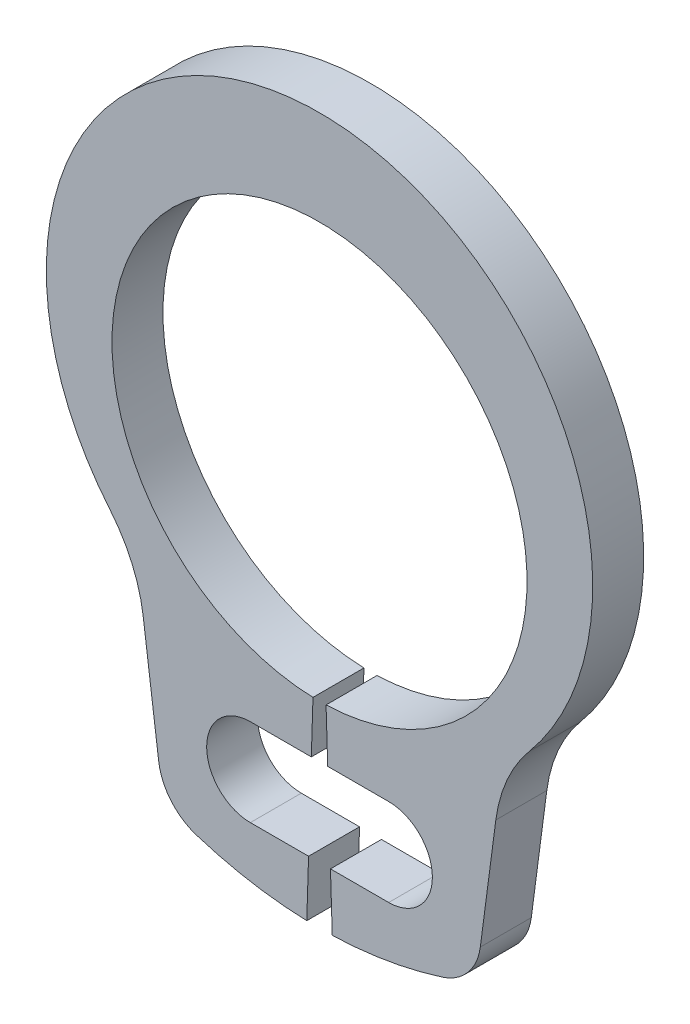
ISO-10303-21;
HEADER;
FILE_DESCRIPTION(('STEP AP214'),'2;1');
FILE_NAME('part.step','',(''),(''),'','','');
FILE_SCHEMA(('AUTOMOTIVE_DESIGN { 1 0 10303 214 1 1 1 1 }'));
ENDSEC;
DATA;
#1=APPLICATION_CONTEXT('core data for automotive mechanical design processes');
#2=APPLICATION_PROTOCOL_DEFINITION('international standard','automotive_design',2000,#1);
#3=PRODUCT_CONTEXT('',#1,'mechanical');
#4=PRODUCT('Part','Part','',(#3));
#5=PRODUCT_RELATED_PRODUCT_CATEGORY('part','',(#4));
#6=PRODUCT_DEFINITION_FORMATION('','',#4);
#7=PRODUCT_DEFINITION_CONTEXT('part definition',#1,'design');
#8=PRODUCT_DEFINITION('design','',#6,#7);
#9=PRODUCT_DEFINITION_SHAPE('','',#8);
#10=(LENGTH_UNIT() NAMED_UNIT(*) SI_UNIT(.MILLI.,.METRE.));
#11=(NAMED_UNIT(*) PLANE_ANGLE_UNIT() SI_UNIT($,.RADIAN.));
#12=(NAMED_UNIT(*) SI_UNIT($,.STERADIAN.) SOLID_ANGLE_UNIT());
#13=UNCERTAINTY_MEASURE_WITH_UNIT(LENGTH_MEASURE(1.E-05),#10,'distance_accuracy_value','');
#14=(GEOMETRIC_REPRESENTATION_CONTEXT(3) GLOBAL_UNCERTAINTY_ASSIGNED_CONTEXT((#13)) GLOBAL_UNIT_ASSIGNED_CONTEXT((#10,
#11,#12)) REPRESENTATION_CONTEXT('',''));
#15=CARTESIAN_POINT('',(0.,0.,0.));
#16=DIRECTION('',(0.,0.,1.));
#17=DIRECTION('',(1.,0.,0.));
#18=AXIS2_PLACEMENT_3D('',#15,#16,#17);
#19=CARTESIAN_POINT('',(-0.0898648648648649,-2.84858285925876,-0.7));
#20=DIRECTION('',(0.999502757634653,-0.0315315315315315,0.));
#21=DIRECTION('',(0.0315315315315315,0.999502757634653,0.));
#22=AXIS2_PLACEMENT_3D('',#19,#20,#21);
#23=PLANE('',#22);
#24=DIRECTION('',(0.,0.,1.));
#25=VECTOR('',#24,1.);
#26=CARTESIAN_POINT('',(-0.112563884090892,-3.56810808401126,-0.7));
#27=LINE('',#26,#25);
#28=CARTESIAN_POINT('',(-0.112563884090892,-3.56810808401126,-0.7));
#29=VERTEX_POINT('',#28);
#30=CARTESIAN_POINT('',(-0.112563884090892,-3.56810808401126,0.));
#31=VERTEX_POINT('',#30);
#32=EDGE_CURVE('E208',#29,#31,#27,.T.);
#33=ORIENTED_EDGE('',*,*,#32,.F.);
#34=DIRECTION('',(0.0315315315315315,0.999502757634653,0.));
#35=VECTOR('',#34,1.);
#36=CARTESIAN_POINT('',(-0.0898648648648649,-2.84858285925876,-0.7));
#37=LINE('',#36,#35);
#38=CARTESIAN_POINT('',(-0.0898648648648649,-2.84858285925876,-0.7));
#39=VERTEX_POINT('',#38);
#40=EDGE_CURVE('E198',#29,#39,#37,.T.);
#41=ORIENTED_EDGE('',*,*,#40,.T.);
#42=DIRECTION('',(0.,0.,1.));
#43=VECTOR('',#42,1.);
#44=CARTESIAN_POINT('',(-0.0898648648648649,-2.84858285925876,-0.7));
#45=LINE('',#44,#43);
#46=CARTESIAN_POINT('',(-0.0898648648648649,-2.84858285925876,0.));
#47=VERTEX_POINT('',#46);
#48=EDGE_CURVE('E11',#39,#47,#45,.T.);
#49=ORIENTED_EDGE('',*,*,#48,.T.);
#50=DIRECTION('',(0.0315315315315315,0.999502757634653,0.));
#51=VECTOR('',#50,1.);
#52=CARTESIAN_POINT('',(-0.0898648648648649,-2.84858285925876,0.));
#53=LINE('',#52,#51);
#54=EDGE_CURVE('E288',#31,#47,#53,.T.);
#55=ORIENTED_EDGE('',*,*,#54,.F.);
#56=EDGE_LOOP('',(#33,#41,#49,#55));
#57=FACE_BOUND('',#56,.T.);
#58=ADVANCED_FACE('F39',(#57),#23,.T.);
#59=CARTESIAN_POINT('',(0.0898648648648649,-2.84858285925876,-0.7));
#60=DIRECTION('',(-0.999502757634653,-0.0315315315315315,0.));
#61=DIRECTION('',(0.0315315315315315,-0.999502757634653,0.));
#62=AXIS2_PLACEMENT_3D('',#59,#60,#61);
#63=PLANE('',#62);
#64=DIRECTION('',(0.,0.,-1.));
#65=VECTOR('',#64,1.);
#66=CARTESIAN_POINT('',(0.112563884090892,-3.56810808401126,-0.7));
#67=LINE('',#66,#65);
#68=CARTESIAN_POINT('',(0.112563884090892,-3.56810808401126,0.));
#69=VERTEX_POINT('',#68);
#70=CARTESIAN_POINT('',(0.112563884090892,-3.56810808401126,-0.7));
#71=VERTEX_POINT('',#70);
#72=EDGE_CURVE('E322',#69,#71,#67,.T.);
#73=ORIENTED_EDGE('',*,*,#72,.F.);
#74=DIRECTION('',(0.0315315315315315,-0.999502757634653,0.));
#75=VECTOR('',#74,1.);
#76=CARTESIAN_POINT('',(0.0898648648648649,-2.84858285925876,0.));
#77=LINE('',#76,#75);
#78=CARTESIAN_POINT('',(0.0898648648648649,-2.84858285925876,0.));
#79=VERTEX_POINT('',#78);
#80=EDGE_CURVE('E259',#79,#69,#77,.T.);
#81=ORIENTED_EDGE('',*,*,#80,.F.);
#82=DIRECTION('',(0.,0.,1.));
#83=VECTOR('',#82,1.);
#84=CARTESIAN_POINT('',(0.0898648648648649,-2.84858285925876,-0.7));
#85=LINE('',#84,#83);
#86=CARTESIAN_POINT('',(0.0898648648648649,-2.84858285925876,-0.7));
#87=VERTEX_POINT('',#86);
#88=EDGE_CURVE('E43',#87,#79,#85,.T.);
#89=ORIENTED_EDGE('',*,*,#88,.F.);
#90=DIRECTION('',(0.0315315315315315,-0.999502757634653,0.));
#91=VECTOR('',#90,1.);
#92=CARTESIAN_POINT('',(0.0898648648648649,-2.84858285925876,-0.7));
#93=LINE('',#92,#91);
#94=EDGE_CURVE('E225',#87,#71,#93,.T.);
#95=ORIENTED_EDGE('',*,*,#94,.T.);
#96=EDGE_LOOP('',(#73,#81,#89,#95));
#97=FACE_BOUND('',#96,.T.);
#98=ADVANCED_FACE('F318',(#97),#63,.T.);
#99=CARTESIAN_POINT('',(0.,0.,-0.7));
#100=DIRECTION('',(0.,0.,1.));
#101=DIRECTION('',(1.,0.,0.));
#102=AXIS2_PLACEMENT_3D('',#99,#100,#101);
#103=CYLINDRICAL_SURFACE('',#102,2.85);
#104=CARTESIAN_POINT('',(0.,0.,0.));
#105=DIRECTION('',(0.,0.,-1.));
#106=DIRECTION('',(1.,0.,0.));
#107=AXIS2_PLACEMENT_3D('',#104,#105,#106);
#108=CIRCLE('',#107,2.85);
#109=EDGE_CURVE('E213',#47,#79,#108,.T.);
#110=ORIENTED_EDGE('',*,*,#109,.F.);
#111=ORIENTED_EDGE('',*,*,#48,.F.);
#112=CARTESIAN_POINT('',(0.,0.,-0.7));
#113=DIRECTION('',(0.,0.,-1.));
#114=DIRECTION('',(1.,0.,0.));
#115=AXIS2_PLACEMENT_3D('',#112,#113,#114);
#116=CIRCLE('',#115,2.85);
#117=EDGE_CURVE('E217',#39,#87,#116,.T.);
#118=ORIENTED_EDGE('',*,*,#117,.T.);
#119=ORIENTED_EDGE('',*,*,#88,.T.);
#120=EDGE_LOOP('',(#110,#111,#118,#119));
#121=FACE_BOUND('',#120,.T.);
#122=ADVANCED_FACE('F41',(#121),#103,.F.);
#123=DIRECTION('',(0.,0.,-1.));
#124=VECTOR('',#123,1.);
#125=CARTESIAN_POINT('',(-0.150420545864774,-4.76810808401126,-0.7));
#126=LINE('',#125,#124);
#127=CARTESIAN_POINT('',(-0.150420545864773,-4.76810808401126,0.));
#128=VERTEX_POINT('',#127);
#129=CARTESIAN_POINT('',(-0.150420545864773,-4.76810808401126,-0.7));
#130=VERTEX_POINT('',#129);
#131=EDGE_CURVE('E345',#128,#130,#126,.T.);
#132=ORIENTED_EDGE('',*,*,#131,.F.);
#133=CARTESIAN_POINT('',(-0.175,-5.54724030487233,0.));
#134=VERTEX_POINT('',#133);
#135=EDGE_CURVE('E221',#134,#128,#53,.T.);
#136=ORIENTED_EDGE('',*,*,#135,.F.);
#137=DIRECTION('',(0.,0.,1.));
#138=VECTOR('',#137,1.);
#139=CARTESIAN_POINT('',(-0.175,-5.54724030487233,-0.7));
#140=LINE('',#139,#138);
#141=CARTESIAN_POINT('',(-0.175,-5.54724030487233,-0.7));
#142=VERTEX_POINT('',#141);
#143=EDGE_CURVE('E48',#142,#134,#140,.T.);
#144=ORIENTED_EDGE('',*,*,#143,.F.);
#145=EDGE_CURVE('E255',#142,#130,#37,.T.);
#146=ORIENTED_EDGE('',*,*,#145,.T.);
#147=EDGE_LOOP('',(#132,#136,#144,#146));
#148=FACE_BOUND('',#147,.T.);
#149=ADVANCED_FACE('F388',(#148),#23,.T.);
#150=CARTESIAN_POINT('',(0.,0.,-0.7));
#151=DIRECTION('',(0.,0.,1.));
#152=DIRECTION('',(1.,0.,0.));
#153=AXIS2_PLACEMENT_3D('',#150,#151,#152);
#154=CYLINDRICAL_SURFACE('',#153,5.55);
#155=CARTESIAN_POINT('',(0.,0.,0.));
#156=DIRECTION('',(0.,0.,1.));
#157=DIRECTION('',(1.,0.,0.));
#158=AXIS2_PLACEMENT_3D('',#155,#156,#157);
#159=CIRCLE('',#158,5.55);
#160=CARTESIAN_POINT('',(-1.69352555944154,-5.28530710361453,0.));
#161=VERTEX_POINT('',#160);
#162=EDGE_CURVE('E285',#161,#134,#159,.T.);
#163=ORIENTED_EDGE('',*,*,#162,.F.);
#164=DIRECTION('',(0.,0.,1.));
#165=VECTOR('',#164,1.);
#166=CARTESIAN_POINT('',(-1.69352555944154,-5.28530710361453,-0.7));
#167=LINE('',#166,#165);
#168=CARTESIAN_POINT('',(-1.69352555944154,-5.28530710361453,-0.7));
#169=VERTEX_POINT('',#168);
#170=EDGE_CURVE('E292',#169,#161,#167,.T.);
#171=ORIENTED_EDGE('',*,*,#170,.F.);
#172=CARTESIAN_POINT('',(0.,0.,-0.7));
#173=DIRECTION('',(0.,0.,1.));
#174=DIRECTION('',(1.,0.,0.));
#175=AXIS2_PLACEMENT_3D('',#172,#173,#174);
#176=CIRCLE('',#175,5.55);
#177=EDGE_CURVE('E248',#169,#142,#176,.T.);
#178=ORIENTED_EDGE('',*,*,#177,.T.);
#179=ORIENTED_EDGE('',*,*,#143,.T.);
#180=EDGE_LOOP('',(#163,#171,#178,#179));
#181=FACE_BOUND('',#180,.T.);
#182=ADVANCED_FACE('F387',(#181),#154,.T.);
#183=CARTESIAN_POINT('',(-1.4646707541116,-4.5710764139369,-0.7));
#184=DIRECTION('',(0.,0.,1.));
#185=DIRECTION('',(1.,0.,0.));
#186=AXIS2_PLACEMENT_3D('',#183,#184,#185);
#187=CYLINDRICAL_SURFACE('',#186,0.750000000000001);
#188=CARTESIAN_POINT('',(-1.4646707541116,-4.5710764139369,0.));
#189=DIRECTION('',(0.,0.,1.));
#190=DIRECTION('',(1.,0.,0.));
#191=AXIS2_PLACEMENT_3D('',#188,#189,#190);
#192=CIRCLE('',#191,0.750000000000001);
#193=CARTESIAN_POINT('',(-2.20825440014195,-4.66897105810193,0.));
#194=VERTEX_POINT('',#193);
#195=EDGE_CURVE('E282',#194,#161,#192,.T.);
#196=ORIENTED_EDGE('',*,*,#195,.F.);
#197=DIRECTION('',(0.,0.,1.));
#198=VECTOR('',#197,1.);
#199=CARTESIAN_POINT('',(-2.20825440014195,-4.66897105810193,-0.7));
#200=LINE('',#199,#198);
#201=CARTESIAN_POINT('',(-2.20825440014195,-4.66897105810193,-0.7));
#202=VERTEX_POINT('',#201);
#203=EDGE_CURVE('E295',#202,#194,#200,.T.);
#204=ORIENTED_EDGE('',*,*,#203,.F.);
#205=CARTESIAN_POINT('',(-1.4646707541116,-4.5710764139369,-0.7));
#206=DIRECTION('',(0.,0.,1.));
#207=DIRECTION('',(1.,0.,0.));
#208=AXIS2_PLACEMENT_3D('',#205,#206,#207);
#209=CIRCLE('',#208,0.750000000000001);
#210=EDGE_CURVE('E246',#202,#169,#209,.T.);
#211=ORIENTED_EDGE('',*,*,#210,.T.);
#212=ORIENTED_EDGE('',*,*,#170,.T.);
#213=EDGE_LOOP('',(#196,#204,#211,#212));
#214=FACE_BOUND('',#213,.T.);
#215=ADVANCED_FACE('F385',(#214),#187,.T.);
#216=CARTESIAN_POINT('',(-2.42125260136697,-3.05108909514396,-0.7));
#217=DIRECTION('',(-0.99144486137381,-0.130526192220052,0.));
#218=DIRECTION('',(0.130526192220052,-0.99144486137381,0.));
#219=AXIS2_PLACEMENT_3D('',#216,#217,#218);
#220=PLANE('',#219);
#221=DIRECTION('',(0.130526192220052,-0.99144486137381,0.));
#222=VECTOR('',#221,1.);
#223=CARTESIAN_POINT('',(-2.42125260136697,-3.05108909514396,0.));
#224=LINE('',#223,#222);
#225=CARTESIAN_POINT('',(-2.42125260136697,-3.05108909514396,0.));
#226=VERTEX_POINT('',#225);
#227=EDGE_CURVE('E276',#226,#194,#224,.T.);
#228=ORIENTED_EDGE('',*,*,#227,.F.);
#229=DIRECTION('',(0.,0.,1.));
#230=VECTOR('',#229,1.);
#231=CARTESIAN_POINT('',(-2.42125260136697,-3.05108909514396,-0.7));
#232=LINE('',#231,#230);
#233=CARTESIAN_POINT('',(-2.42125260136697,-3.05108909514396,-0.7));
#234=VERTEX_POINT('',#233);
#235=EDGE_CURVE('E298',#234,#226,#232,.T.);
#236=ORIENTED_EDGE('',*,*,#235,.F.);
#237=DIRECTION('',(0.130526192220052,-0.99144486137381,0.));
#238=VECTOR('',#237,1.);
#239=CARTESIAN_POINT('',(-2.42125260136697,-3.05108909514396,-0.7));
#240=LINE('',#239,#238);
#241=EDGE_CURVE('E243',#234,#202,#240,.T.);
#242=ORIENTED_EDGE('',*,*,#241,.T.);
#243=ORIENTED_EDGE('',*,*,#203,.T.);
#244=EDGE_LOOP('',(#228,#236,#242,#243));
#245=FACE_BOUND('',#244,.T.);
#246=ADVANCED_FACE('F380',(#245),#220,.T.);
#247=CARTESIAN_POINT('',(-4.44894498459351,-3.31803986173468,-0.7));
#248=DIRECTION('',(0.,0.,1.));
#249=DIRECTION('',(1.,0.,0.));
#250=AXIS2_PLACEMENT_3D('',#247,#248,#249);
#251=CYLINDRICAL_SURFACE('',#250,2.04518926087008);
#252=CARTESIAN_POINT('',(-4.44894498459351,-3.31803986173468,0.));
#253=DIRECTION('',(0.,0.,-1.));
#254=DIRECTION('',(1.,0.,0.));
#255=AXIS2_PLACEMENT_3D('',#252,#253,#254);
#256=CIRCLE('',#255,2.04518926087008);
#257=CARTESIAN_POINT('',(-2.87932657231504,-2.00689640939443,0.));
#258=VERTEX_POINT('',#257);
#259=EDGE_CURVE('E277',#258,#226,#256,.T.);
#260=ORIENTED_EDGE('',*,*,#259,.F.);
#261=DIRECTION('',(0.,0.,1.));
#262=VECTOR('',#261,1.);
#263=CARTESIAN_POINT('',(-2.87932657231504,-2.00689640939443,-0.7));
#264=LINE('',#263,#262);
#265=CARTESIAN_POINT('',(-2.87932657231504,-2.00689640939443,-0.7));
#266=VERTEX_POINT('',#265);
#267=EDGE_CURVE('E296',#266,#258,#264,.T.);
#268=ORIENTED_EDGE('',*,*,#267,.F.);
#269=CARTESIAN_POINT('',(-4.44894498459351,-3.31803986173468,-0.7));
#270=DIRECTION('',(0.,0.,-1.));
#271=DIRECTION('',(1.,0.,0.));
#272=AXIS2_PLACEMENT_3D('',#269,#270,#271);
#273=CIRCLE('',#272,2.04518926087008);
#274=EDGE_CURVE('E239',#266,#234,#273,.T.);
#275=ORIENTED_EDGE('',*,*,#274,.T.);
#276=ORIENTED_EDGE('',*,*,#235,.T.);
#277=EDGE_LOOP('',(#260,#268,#275,#276));
#278=FACE_BOUND('',#277,.T.);
#279=ADVANCED_FACE('F373',(#278),#251,.F.);
#280=CARTESIAN_POINT('',(0.,0.398280640586792,-0.7));
#281=DIRECTION('',(0.,0.,1.));
#282=DIRECTION('',(1.,0.,0.));
#283=AXIS2_PLACEMENT_3D('',#280,#281,#282);
#284=CYLINDRICAL_SURFACE('',#283,3.75171935941321);
#285=CARTESIAN_POINT('',(0.,0.398280640586792,0.));
#286=DIRECTION('',(0.,0.,1.));
#287=DIRECTION('',(1.,0.,0.));
#288=AXIS2_PLACEMENT_3D('',#285,#286,#287);
#289=CIRCLE('',#288,3.75171935941321);
#290=CARTESIAN_POINT('',(2.87932657231504,-2.00689640939443,0.));
#291=VERTEX_POINT('',#290);
#292=EDGE_CURVE('E271',#291,#258,#289,.T.);
#293=ORIENTED_EDGE('',*,*,#292,.F.);
#294=DIRECTION('',(0.,0.,1.));
#295=VECTOR('',#294,1.);
#296=CARTESIAN_POINT('',(2.87932657231504,-2.00689640939443,-0.7));
#297=LINE('',#296,#295);
#298=CARTESIAN_POINT('',(2.87932657231504,-2.00689640939443,-0.7));
#299=VERTEX_POINT('',#298);
#300=EDGE_CURVE('E297',#299,#291,#297,.T.);
#301=ORIENTED_EDGE('',*,*,#300,.F.);
#302=CARTESIAN_POINT('',(0.,0.398280640586792,-0.7));
#303=DIRECTION('',(0.,0.,1.));
#304=DIRECTION('',(1.,0.,0.));
#305=AXIS2_PLACEMENT_3D('',#302,#303,#304);
#306=CIRCLE('',#305,3.75171935941321);
#307=EDGE_CURVE('E240',#299,#266,#306,.T.);
#308=ORIENTED_EDGE('',*,*,#307,.T.);
#309=ORIENTED_EDGE('',*,*,#267,.T.);
#310=EDGE_LOOP('',(#293,#301,#308,#309));
#311=FACE_BOUND('',#310,.T.);
#312=ADVANCED_FACE('F367',(#311),#284,.T.);
#313=CARTESIAN_POINT('',(4.44894498459351,-3.31803986173468,-0.7));
#314=DIRECTION('',(0.,0.,1.));
#315=DIRECTION('',(1.,0.,0.));
#316=AXIS2_PLACEMENT_3D('',#313,#314,#315);
#317=CYLINDRICAL_SURFACE('',#316,2.04518926087008);
#318=CARTESIAN_POINT('',(4.44894498459351,-3.31803986173468,0.));
#319=DIRECTION('',(0.,0.,-1.));
#320=DIRECTION('',(1.,0.,0.));
#321=AXIS2_PLACEMENT_3D('',#318,#319,#320);
#322=CIRCLE('',#321,2.04518926087008);
#323=CARTESIAN_POINT('',(2.42125260136697,-3.05108909514396,0.));
#324=VERTEX_POINT('',#323);
#325=EDGE_CURVE('E268',#324,#291,#322,.T.);
#326=ORIENTED_EDGE('',*,*,#325,.F.);
#327=DIRECTION('',(0.,0.,1.));
#328=VECTOR('',#327,1.);
#329=CARTESIAN_POINT('',(2.42125260136697,-3.05108909514396,-0.7));
#330=LINE('',#329,#328);
#331=CARTESIAN_POINT('',(2.42125260136697,-3.05108909514396,-0.7));
#332=VERTEX_POINT('',#331);
#333=EDGE_CURVE('E305',#332,#324,#330,.T.);
#334=ORIENTED_EDGE('',*,*,#333,.F.);
#335=CARTESIAN_POINT('',(4.44894498459351,-3.31803986173468,-0.7));
#336=DIRECTION('',(0.,0.,-1.));
#337=DIRECTION('',(1.,0.,0.));
#338=AXIS2_PLACEMENT_3D('',#335,#336,#337);
#339=CIRCLE('',#338,2.04518926087008);
#340=EDGE_CURVE('E234',#332,#299,#339,.T.);
#341=ORIENTED_EDGE('',*,*,#340,.T.);
#342=ORIENTED_EDGE('',*,*,#300,.T.);
#343=EDGE_LOOP('',(#326,#334,#341,#342));
#344=FACE_BOUND('',#343,.T.);
#345=ADVANCED_FACE('F362',(#344),#317,.F.);
#346=CARTESIAN_POINT('',(2.42125260136697,-3.05108909514396,-0.7));
#347=DIRECTION('',(0.99144486137381,-0.130526192220052,0.));
#348=DIRECTION('',(0.130526192220052,0.99144486137381,0.));
#349=AXIS2_PLACEMENT_3D('',#346,#347,#348);
#350=PLANE('',#349);
#351=DIRECTION('',(0.130526192220052,0.99144486137381,0.));
#352=VECTOR('',#351,1.);
#353=CARTESIAN_POINT('',(2.42125260136697,-3.05108909514396,0.));
#354=LINE('',#353,#352);
#355=CARTESIAN_POINT('',(2.20825440014195,-4.66897105810193,0.));
#356=VERTEX_POINT('',#355);
#357=EDGE_CURVE('E270',#356,#324,#354,.T.);
#358=ORIENTED_EDGE('',*,*,#357,.F.);
#359=DIRECTION('',(0.,0.,1.));
#360=VECTOR('',#359,1.);
#361=CARTESIAN_POINT('',(2.20825440014195,-4.66897105810193,-0.7));
#362=LINE('',#361,#360);
#363=CARTESIAN_POINT('',(2.20825440014195,-4.66897105810193,-0.7));
#364=VERTEX_POINT('',#363);
#365=EDGE_CURVE('E302',#364,#356,#362,.T.);
#366=ORIENTED_EDGE('',*,*,#365,.F.);
#367=DIRECTION('',(0.130526192220052,0.99144486137381,0.));
#368=VECTOR('',#367,1.);
#369=CARTESIAN_POINT('',(2.42125260136697,-3.05108909514396,-0.7));
#370=LINE('',#369,#368);
#371=EDGE_CURVE('E233',#364,#332,#370,.T.);
#372=ORIENTED_EDGE('',*,*,#371,.T.);
#373=ORIENTED_EDGE('',*,*,#333,.T.);
#374=EDGE_LOOP('',(#358,#366,#372,#373));
#375=FACE_BOUND('',#374,.T.);
#376=ADVANCED_FACE('F363',(#375),#350,.T.);
#377=CARTESIAN_POINT('',(1.4646707541116,-4.5710764139369,-0.7));
#378=DIRECTION('',(0.,0.,1.));
#379=DIRECTION('',(1.,0.,0.));
#380=AXIS2_PLACEMENT_3D('',#377,#378,#379);
#381=CYLINDRICAL_SURFACE('',#380,0.750000000000001);
#382=CARTESIAN_POINT('',(1.4646707541116,-4.5710764139369,0.));
#383=DIRECTION('',(0.,0.,1.));
#384=DIRECTION('',(-1.,0.,0.));
#385=AXIS2_PLACEMENT_3D('',#382,#383,#384);
#386=CIRCLE('',#385,0.750000000000001);
#387=CARTESIAN_POINT('',(1.69352555944153,-5.28530710361454,0.));
#388=VERTEX_POINT('',#387);
#389=EDGE_CURVE('E263',#388,#356,#386,.T.);
#390=ORIENTED_EDGE('',*,*,#389,.F.);
#391=DIRECTION('',(0.,0.,1.));
#392=VECTOR('',#391,1.);
#393=CARTESIAN_POINT('',(1.69352555944153,-5.28530710361454,-0.7));
#394=LINE('',#393,#392);
#395=CARTESIAN_POINT('',(1.69352555944153,-5.28530710361454,-0.7));
#396=VERTEX_POINT('',#395);
#397=EDGE_CURVE('E306',#396,#388,#394,.T.);
#398=ORIENTED_EDGE('',*,*,#397,.F.);
#399=CARTESIAN_POINT('',(1.4646707541116,-4.5710764139369,-0.7));
#400=DIRECTION('',(0.,0.,1.));
#401=DIRECTION('',(-1.,0.,0.));
#402=AXIS2_PLACEMENT_3D('',#399,#400,#401);
#403=CIRCLE('',#402,0.750000000000001);
#404=EDGE_CURVE('E226',#396,#364,#403,.T.);
#405=ORIENTED_EDGE('',*,*,#404,.T.);
#406=ORIENTED_EDGE('',*,*,#365,.T.);
#407=EDGE_LOOP('',(#390,#398,#405,#406));
#408=FACE_BOUND('',#407,.T.);
#409=ADVANCED_FACE('F356',(#408),#381,.T.);
#410=CARTESIAN_POINT('',(0.,0.,-0.7));
#411=DIRECTION('',(0.,0.,1.));
#412=DIRECTION('',(1.,0.,0.));
#413=AXIS2_PLACEMENT_3D('',#410,#411,#412);
#414=CYLINDRICAL_SURFACE('',#413,5.55);
#415=CARTESIAN_POINT('',(0.,0.,0.));
#416=DIRECTION('',(0.,0.,1.));
#417=DIRECTION('',(1.,0.,0.));
#418=AXIS2_PLACEMENT_3D('',#415,#416,#417);
#419=CIRCLE('',#418,5.55);
#420=CARTESIAN_POINT('',(0.175,-5.54724030487233,0.));
#421=VERTEX_POINT('',#420);
#422=EDGE_CURVE('E261',#421,#388,#419,.T.);
#423=ORIENTED_EDGE('',*,*,#422,.F.);
#424=DIRECTION('',(0.,0.,1.));
#425=VECTOR('',#424,1.);
#426=CARTESIAN_POINT('',(0.175,-5.54724030487233,-0.7));
#427=LINE('',#426,#425);
#428=CARTESIAN_POINT('',(0.175,-5.54724030487233,-0.7));
#429=VERTEX_POINT('',#428);
#430=EDGE_CURVE('E310',#429,#421,#427,.T.);
#431=ORIENTED_EDGE('',*,*,#430,.F.);
#432=CARTESIAN_POINT('',(0.,0.,-0.7));
#433=DIRECTION('',(0.,0.,1.));
#434=DIRECTION('',(1.,0.,0.));
#435=AXIS2_PLACEMENT_3D('',#432,#433,#434);
#436=CIRCLE('',#435,5.55);
#437=EDGE_CURVE('E224',#429,#396,#436,.T.);
#438=ORIENTED_EDGE('',*,*,#437,.T.);
#439=ORIENTED_EDGE('',*,*,#397,.T.);
#440=EDGE_LOOP('',(#423,#431,#438,#439));
#441=FACE_BOUND('',#440,.T.);
#442=ADVANCED_FACE('F352',(#441),#414,.T.);
#443=DIRECTION('',(0.,0.,1.));
#444=VECTOR('',#443,1.);
#445=CARTESIAN_POINT('',(0.150420545864774,-4.76810808401126,-0.7));
#446=LINE('',#445,#444);
#447=CARTESIAN_POINT('',(0.150420545864774,-4.76810808401126,-0.7));
#448=VERTEX_POINT('',#447);
#449=CARTESIAN_POINT('',(0.150420545864774,-4.76810808401126,0.));
#450=VERTEX_POINT('',#449);
#451=EDGE_CURVE('E340',#448,#450,#446,.T.);
#452=ORIENTED_EDGE('',*,*,#451,.F.);
#453=EDGE_CURVE('E220',#448,#429,#93,.T.);
#454=ORIENTED_EDGE('',*,*,#453,.T.);
#455=ORIENTED_EDGE('',*,*,#430,.T.);
#456=EDGE_CURVE('E260',#450,#421,#77,.T.);
#457=ORIENTED_EDGE('',*,*,#456,.F.);
#458=EDGE_LOOP('',(#452,#454,#455,#457));
#459=FACE_BOUND('',#458,.T.);
#460=ADVANCED_FACE('F355',(#459),#63,.T.);
#461=CARTESIAN_POINT('',(0.,0.,-0.7));
#462=DIRECTION('',(0.,0.,1.));
#463=DIRECTION('',(1.,0.,0.));
#464=AXIS2_PLACEMENT_3D('',#461,#462,#463);
#465=PLANE('',#464);
#466=CARTESIAN_POINT('',(0.95,-4.16810808401126,-0.7));
#467=DIRECTION('',(0.,0.,1.));
#468=DIRECTION('',(1.,0.,0.));
#469=AXIS2_PLACEMENT_3D('',#466,#467,#468);
#470=CIRCLE('',#469,0.6);
#471=CARTESIAN_POINT('',(0.95,-4.76810808401126,-0.7));
#472=VERTEX_POINT('',#471);
#473=CARTESIAN_POINT('',(0.95,-3.56810808401126,-0.7));
#474=VERTEX_POINT('',#473);
#475=EDGE_CURVE('E206',#472,#474,#470,.T.);
#476=ORIENTED_EDGE('',*,*,#475,.T.);
#477=DIRECTION('',(-1.,0.,0.));
#478=VECTOR('',#477,1.);
#479=CARTESIAN_POINT('',(-0.95,-3.56810808401126,-0.7));
#480=LINE('',#479,#478);
#481=EDGE_CURVE('E61',#474,#71,#480,.T.);
#482=ORIENTED_EDGE('',*,*,#481,.T.);
#483=ORIENTED_EDGE('',*,*,#94,.F.);
#484=ORIENTED_EDGE('',*,*,#117,.F.);
#485=ORIENTED_EDGE('',*,*,#40,.F.);
#486=CARTESIAN_POINT('',(-0.95,-3.56810808401126,-0.7));
#487=VERTEX_POINT('',#486);
#488=EDGE_CURVE('E179',#29,#487,#480,.T.);
#489=ORIENTED_EDGE('',*,*,#488,.T.);
#490=CARTESIAN_POINT('',(-0.95,-4.16810808401126,-0.7));
#491=DIRECTION('',(0.,0.,1.));
#492=DIRECTION('',(1.,0.,0.));
#493=AXIS2_PLACEMENT_3D('',#490,#491,#492);
#494=CIRCLE('',#493,0.6);
#495=CARTESIAN_POINT('',(-0.95,-4.76810808401126,-0.7));
#496=VERTEX_POINT('',#495);
#497=EDGE_CURVE('E197',#487,#496,#494,.T.);
#498=ORIENTED_EDGE('',*,*,#497,.T.);
#499=DIRECTION('',(1.,0.,0.));
#500=VECTOR('',#499,1.);
#501=CARTESIAN_POINT('',(0.95,-4.76810808401126,-0.7));
#502=LINE('',#501,#500);
#503=EDGE_CURVE('E186',#496,#130,#502,.T.);
#504=ORIENTED_EDGE('',*,*,#503,.T.);
#505=ORIENTED_EDGE('',*,*,#145,.F.);
#506=ORIENTED_EDGE('',*,*,#177,.F.);
#507=ORIENTED_EDGE('',*,*,#210,.F.);
#508=ORIENTED_EDGE('',*,*,#241,.F.);
#509=ORIENTED_EDGE('',*,*,#274,.F.);
#510=ORIENTED_EDGE('',*,*,#307,.F.);
#511=ORIENTED_EDGE('',*,*,#340,.F.);
#512=ORIENTED_EDGE('',*,*,#371,.F.);
#513=ORIENTED_EDGE('',*,*,#404,.F.);
#514=ORIENTED_EDGE('',*,*,#437,.F.);
#515=ORIENTED_EDGE('',*,*,#453,.F.);
#516=EDGE_CURVE('E328',#448,#472,#502,.T.);
#517=ORIENTED_EDGE('',*,*,#516,.T.);
#518=EDGE_LOOP('',(#476,#482,#483,#484,#485,#489,#498,#504,#505,#506,#507,#508,#509,#510,#511,
#512,#513,#514,#515,#517));
#519=FACE_BOUND('',#518,.T.);
#520=ADVANCED_FACE('F193',(#519),#465,.F.);
#521=CARTESIAN_POINT('',(0.,0.,0.));
#522=DIRECTION('',(0.,0.,1.));
#523=DIRECTION('',(1.,0.,0.));
#524=AXIS2_PLACEMENT_3D('',#521,#522,#523);
#525=PLANE('',#524);
#526=DIRECTION('',(-1.,0.,0.));
#527=VECTOR('',#526,1.);
#528=CARTESIAN_POINT('',(-0.95,-3.56810808401126,0.));
#529=LINE('',#528,#527);
#530=CARTESIAN_POINT('',(0.95,-3.56810808401126,0.));
#531=VERTEX_POINT('',#530);
#532=EDGE_CURVE('E335',#531,#69,#529,.T.);
#533=ORIENTED_EDGE('',*,*,#532,.F.);
#534=CARTESIAN_POINT('',(0.95,-4.16810808401126,0.));
#535=DIRECTION('',(0.,0.,1.));
#536=DIRECTION('',(1.,0.,0.));
#537=AXIS2_PLACEMENT_3D('',#534,#535,#536);
#538=CIRCLE('',#537,0.6);
#539=CARTESIAN_POINT('',(0.95,-4.76810808401126,0.));
#540=VERTEX_POINT('',#539);
#541=EDGE_CURVE('E201',#540,#531,#538,.T.);
#542=ORIENTED_EDGE('',*,*,#541,.F.);
#543=DIRECTION('',(1.,0.,0.));
#544=VECTOR('',#543,1.);
#545=CARTESIAN_POINT('',(0.95,-4.76810808401126,0.));
#546=LINE('',#545,#544);
#547=EDGE_CURVE('E57',#450,#540,#546,.T.);
#548=ORIENTED_EDGE('',*,*,#547,.F.);
#549=ORIENTED_EDGE('',*,*,#456,.T.);
#550=ORIENTED_EDGE('',*,*,#422,.T.);
#551=ORIENTED_EDGE('',*,*,#389,.T.);
#552=ORIENTED_EDGE('',*,*,#357,.T.);
#553=ORIENTED_EDGE('',*,*,#325,.T.);
#554=ORIENTED_EDGE('',*,*,#292,.T.);
#555=ORIENTED_EDGE('',*,*,#259,.T.);
#556=ORIENTED_EDGE('',*,*,#227,.T.);
#557=ORIENTED_EDGE('',*,*,#195,.T.);
#558=ORIENTED_EDGE('',*,*,#162,.T.);
#559=ORIENTED_EDGE('',*,*,#135,.T.);
#560=CARTESIAN_POINT('',(-0.95,-4.76810808401126,0.));
#561=VERTEX_POINT('',#560);
#562=EDGE_CURVE('E200',#561,#128,#546,.T.);
#563=ORIENTED_EDGE('',*,*,#562,.F.);
#564=CARTESIAN_POINT('',(-0.95,-4.16810808401126,0.));
#565=DIRECTION('',(0.,0.,1.));
#566=DIRECTION('',(1.,0.,0.));
#567=AXIS2_PLACEMENT_3D('',#564,#565,#566);
#568=CIRCLE('',#567,0.6);
#569=CARTESIAN_POINT('',(-0.95,-3.56810808401126,0.));
#570=VERTEX_POINT('',#569);
#571=EDGE_CURVE('E203',#570,#561,#568,.T.);
#572=ORIENTED_EDGE('',*,*,#571,.F.);
#573=EDGE_CURVE('E182',#31,#570,#529,.T.);
#574=ORIENTED_EDGE('',*,*,#573,.F.);
#575=ORIENTED_EDGE('',*,*,#54,.T.);
#576=ORIENTED_EDGE('',*,*,#109,.T.);
#577=ORIENTED_EDGE('',*,*,#80,.T.);
#578=EDGE_LOOP('',(#533,#542,#548,#549,#550,#551,#552,#553,#554,#555,#556,#557,#558,#559,#563,
#572,#574,#575,#576,#577));
#579=FACE_BOUND('',#578,.T.);
#580=ADVANCED_FACE('F321',(#579),#525,.T.);
#581=CARTESIAN_POINT('',(0.95,-4.16810808401126,-0.7));
#582=DIRECTION('',(0.,0.,1.));
#583=DIRECTION('',(1.,0.,0.));
#584=AXIS2_PLACEMENT_3D('',#581,#582,#583);
#585=CYLINDRICAL_SURFACE('',#584,0.6);
#586=ORIENTED_EDGE('',*,*,#541,.T.);
#587=DIRECTION('',(0.,0.,1.));
#588=VECTOR('',#587,1.);
#589=CARTESIAN_POINT('',(0.95,-3.56810808401126,-0.7));
#590=LINE('',#589,#588);
#591=EDGE_CURVE('E333',#474,#531,#590,.T.);
#592=ORIENTED_EDGE('',*,*,#591,.F.);
#593=ORIENTED_EDGE('',*,*,#475,.F.);
#594=DIRECTION('',(0.,0.,1.));
#595=VECTOR('',#594,1.);
#596=CARTESIAN_POINT('',(0.95,-4.76810808401126,-0.7));
#597=LINE('',#596,#595);
#598=EDGE_CURVE('E336',#472,#540,#597,.T.);
#599=ORIENTED_EDGE('',*,*,#598,.T.);
#600=EDGE_LOOP('',(#586,#592,#593,#599));
#601=FACE_BOUND('',#600,.T.);
#602=ADVANCED_FACE('F346',(#601),#585,.F.);
#603=CARTESIAN_POINT('',(-0.95,-4.16810808401126,-0.7));
#604=DIRECTION('',(0.,0.,1.));
#605=DIRECTION('',(1.,0.,0.));
#606=AXIS2_PLACEMENT_3D('',#603,#604,#605);
#607=CYLINDRICAL_SURFACE('',#606,0.6);
#608=ORIENTED_EDGE('',*,*,#571,.T.);
#609=DIRECTION('',(0.,0.,1.));
#610=VECTOR('',#609,1.);
#611=CARTESIAN_POINT('',(-0.95,-4.76810808401126,-0.7));
#612=LINE('',#611,#610);
#613=EDGE_CURVE('E189',#496,#561,#612,.T.);
#614=ORIENTED_EDGE('',*,*,#613,.F.);
#615=ORIENTED_EDGE('',*,*,#497,.F.);
#616=DIRECTION('',(0.,0.,1.));
#617=VECTOR('',#616,1.);
#618=CARTESIAN_POINT('',(-0.95,-3.56810808401126,-0.7));
#619=LINE('',#618,#617);
#620=EDGE_CURVE('E180',#487,#570,#619,.T.);
#621=ORIENTED_EDGE('',*,*,#620,.T.);
#622=EDGE_LOOP('',(#608,#614,#615,#621));
#623=FACE_BOUND('',#622,.T.);
#624=ADVANCED_FACE('F204',(#623),#607,.F.);
#625=CARTESIAN_POINT('',(-0.95,-3.56810808401126,-0.7));
#626=DIRECTION('',(0.,1.,0.));
#627=DIRECTION('',(0.,0.,1.));
#628=AXIS2_PLACEMENT_3D('',#625,#626,#627);
#629=PLANE('',#628);
#630=ORIENTED_EDGE('',*,*,#32,.T.);
#631=ORIENTED_EDGE('',*,*,#573,.T.);
#632=ORIENTED_EDGE('',*,*,#620,.F.);
#633=ORIENTED_EDGE('',*,*,#488,.F.);
#634=EDGE_LOOP('',(#630,#631,#632,#633));
#635=FACE_BOUND('',#634,.T.);
#636=ADVANCED_FACE('F177',(#635),#629,.F.);
#637=CARTESIAN_POINT('',(0.95,-4.76810808401126,-0.7));
#638=DIRECTION('',(0.,-1.,0.));
#639=DIRECTION('',(0.,0.,-1.));
#640=AXIS2_PLACEMENT_3D('',#637,#638,#639);
#641=PLANE('',#640);
#642=ORIENTED_EDGE('',*,*,#131,.T.);
#643=ORIENTED_EDGE('',*,*,#503,.F.);
#644=ORIENTED_EDGE('',*,*,#613,.T.);
#645=ORIENTED_EDGE('',*,*,#562,.T.);
#646=EDGE_LOOP('',(#642,#643,#644,#645));
#647=FACE_BOUND('',#646,.T.);
#648=ADVANCED_FACE('F394',(#647),#641,.F.);
#649=ORIENTED_EDGE('',*,*,#451,.T.);
#650=ORIENTED_EDGE('',*,*,#547,.T.);
#651=ORIENTED_EDGE('',*,*,#598,.F.);
#652=ORIENTED_EDGE('',*,*,#516,.F.);
#653=EDGE_LOOP('',(#649,#650,#651,#652));
#654=FACE_BOUND('',#653,.T.);
#655=ADVANCED_FACE('F347',(#654),#641,.F.);
#656=ORIENTED_EDGE('',*,*,#72,.T.);
#657=ORIENTED_EDGE('',*,*,#481,.F.);
#658=ORIENTED_EDGE('',*,*,#591,.T.);
#659=ORIENTED_EDGE('',*,*,#532,.T.);
#660=EDGE_LOOP('',(#656,#657,#658,#659));
#661=FACE_BOUND('',#660,.T.);
#662=ADVANCED_FACE('F344',(#661),#629,.F.);
#663=CLOSED_SHELL('',(#58,#98,#122,#149,#182,#215,#246,#279,#312,#345,#376,#409,#442,#460,#520,
#580,#602,#624,#636,#648,#655,#662));
#664=MANIFOLD_SOLID_BREP('B2',#663);
#665=ADVANCED_BREP_SHAPE_REPRESENTATION('',(#18,#664),#14);
#666=SHAPE_DEFINITION_REPRESENTATION(#9,#665);
ENDSEC;
END-ISO-10303-21;
